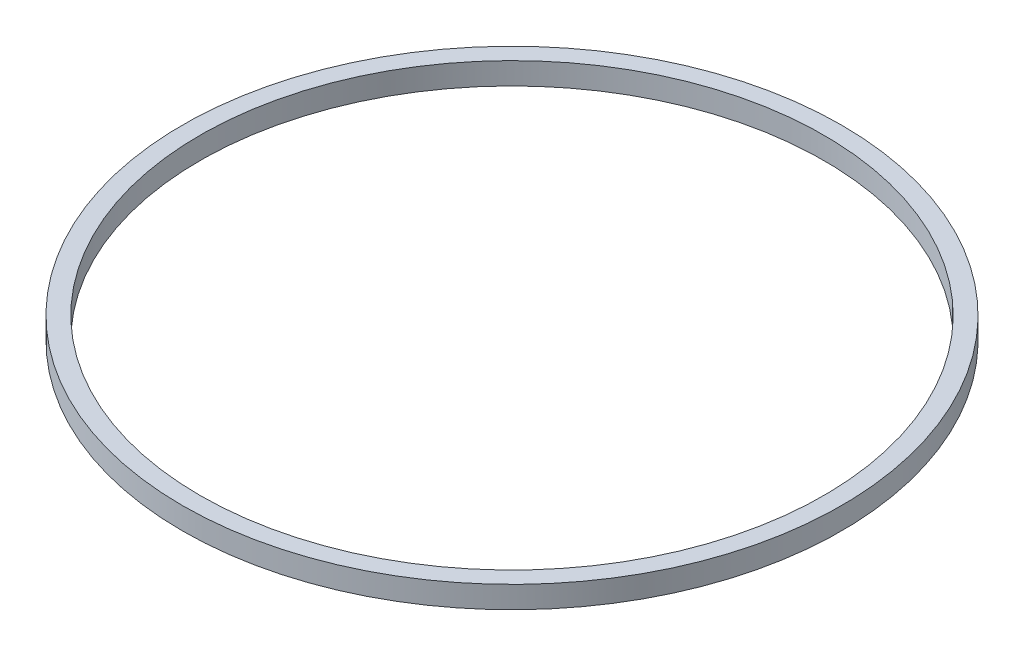
ISO-10303-21;
HEADER;
FILE_DESCRIPTION(('STEP AP214'),'2;1');
FILE_NAME('part.step','',(''),(''),'','','');
FILE_SCHEMA(('AUTOMOTIVE_DESIGN { 1 0 10303 214 1 1 1 1 }'));
ENDSEC;
DATA;
#1=APPLICATION_CONTEXT('core data for automotive mechanical design processes');
#2=APPLICATION_PROTOCOL_DEFINITION('international standard','automotive_design',2000,#1);
#3=PRODUCT_CONTEXT('',#1,'mechanical');
#4=PRODUCT('Part','Part','',(#3));
#5=PRODUCT_RELATED_PRODUCT_CATEGORY('part','',(#4));
#6=PRODUCT_DEFINITION_FORMATION('','',#4);
#7=PRODUCT_DEFINITION_CONTEXT('part definition',#1,'design');
#8=PRODUCT_DEFINITION('design','',#6,#7);
#9=PRODUCT_DEFINITION_SHAPE('','',#8);
#10=(LENGTH_UNIT() NAMED_UNIT(*) SI_UNIT(.MILLI.,.METRE.));
#11=(NAMED_UNIT(*) PLANE_ANGLE_UNIT() SI_UNIT($,.RADIAN.));
#12=(NAMED_UNIT(*) SI_UNIT($,.STERADIAN.) SOLID_ANGLE_UNIT());
#13=UNCERTAINTY_MEASURE_WITH_UNIT(LENGTH_MEASURE(1.E-05),#10,'distance_accuracy_value','');
#14=(GEOMETRIC_REPRESENTATION_CONTEXT(3) GLOBAL_UNCERTAINTY_ASSIGNED_CONTEXT((#13)) GLOBAL_UNIT_ASSIGNED_CONTEXT((#10,
#11,#12)) REPRESENTATION_CONTEXT('',''));
#15=CARTESIAN_POINT('',(0.,0.,0.));
#16=DIRECTION('',(0.,0.,1.));
#17=DIRECTION('',(1.,0.,0.));
#18=AXIS2_PLACEMENT_3D('',#15,#16,#17);
#19=CARTESIAN_POINT('',(0.,5.,0.));
#20=DIRECTION('',(0.,1.,0.));
#21=DIRECTION('',(0.,0.,1.));
#22=AXIS2_PLACEMENT_3D('',#19,#20,#21);
#23=PLANE('',#22);
#24=CARTESIAN_POINT('',(0.,5.,0.));
#25=DIRECTION('',(0.,1.,0.));
#26=DIRECTION('',(0.,0.,1.));
#27=AXIS2_PLACEMENT_3D('',#24,#25,#26);
#28=CIRCLE('',#27,75.);
#29=CARTESIAN_POINT('',(0.,5.,75.));
#30=VERTEX_POINT('',#29);
#31=EDGE_CURVE('E10',#30,#30,#28,.T.);
#32=ORIENTED_EDGE('',*,*,#31,.T.);
#33=EDGE_LOOP('',(#32));
#34=FACE_BOUND('',#33,.T.);
#35=CARTESIAN_POINT('',(0.,5.,0.));
#36=DIRECTION('',(0.,1.,0.));
#37=DIRECTION('',(0.,0.,1.));
#38=AXIS2_PLACEMENT_3D('',#35,#36,#37);
#39=CIRCLE('',#38,71.);
#40=CARTESIAN_POINT('',(0.,5.,71.));
#41=VERTEX_POINT('',#40);
#42=EDGE_CURVE('E56',#41,#41,#39,.T.);
#43=ORIENTED_EDGE('',*,*,#42,.F.);
#44=EDGE_LOOP('',(#43));
#45=FACE_BOUND('',#44,.T.);
#46=ADVANCED_FACE('F43',(#34,#45),#23,.T.);
#47=CARTESIAN_POINT('',(0.,0.,0.));
#48=DIRECTION('',(0.,1.,0.));
#49=DIRECTION('',(0.,0.,1.));
#50=AXIS2_PLACEMENT_3D('',#47,#48,#49);
#51=PLANE('',#50);
#52=CARTESIAN_POINT('',(0.,0.,0.));
#53=DIRECTION('',(0.,1.,0.));
#54=DIRECTION('',(0.,0.,1.));
#55=AXIS2_PLACEMENT_3D('',#52,#53,#54);
#56=CIRCLE('',#55,75.);
#57=CARTESIAN_POINT('',(0.,0.,75.));
#58=VERTEX_POINT('',#57);
#59=EDGE_CURVE('E47',#58,#58,#56,.T.);
#60=ORIENTED_EDGE('',*,*,#59,.F.);
#61=EDGE_LOOP('',(#60));
#62=FACE_BOUND('',#61,.T.);
#63=CARTESIAN_POINT('',(0.,0.,0.));
#64=DIRECTION('',(0.,1.,0.));
#65=DIRECTION('',(0.,0.,1.));
#66=AXIS2_PLACEMENT_3D('',#63,#64,#65);
#67=CIRCLE('',#66,71.);
#68=CARTESIAN_POINT('',(0.,0.,71.));
#69=VERTEX_POINT('',#68);
#70=EDGE_CURVE('E58',#69,#69,#67,.T.);
#71=ORIENTED_EDGE('',*,*,#70,.T.);
#72=EDGE_LOOP('',(#71));
#73=FACE_BOUND('',#72,.T.);
#74=ADVANCED_FACE('F70',(#62,#73),#51,.F.);
#75=CARTESIAN_POINT('',(0.,5.,0.));
#76=DIRECTION('',(0.,-1.,0.));
#77=DIRECTION('',(0.,0.,-1.));
#78=AXIS2_PLACEMENT_3D('',#75,#76,#77);
#79=CYLINDRICAL_SURFACE('',#78,75.);
#80=ORIENTED_EDGE('',*,*,#31,.F.);
#81=EDGE_LOOP('',(#80));
#82=FACE_BOUND('',#81,.T.);
#83=ORIENTED_EDGE('',*,*,#59,.T.);
#84=EDGE_LOOP('',(#83));
#85=FACE_BOUND('',#84,.T.);
#86=ADVANCED_FACE('F45',(#82,#85),#79,.T.);
#87=CARTESIAN_POINT('',(0.,5.,0.));
#88=DIRECTION('',(0.,-1.,0.));
#89=DIRECTION('',(0.,0.,-1.));
#90=AXIS2_PLACEMENT_3D('',#87,#88,#89);
#91=CYLINDRICAL_SURFACE('',#90,71.);
#92=ORIENTED_EDGE('',*,*,#42,.T.);
#93=EDGE_LOOP('',(#92));
#94=FACE_BOUND('',#93,.T.);
#95=ORIENTED_EDGE('',*,*,#70,.F.);
#96=EDGE_LOOP('',(#95));
#97=FACE_BOUND('',#96,.T.);
#98=ADVANCED_FACE('F66',(#94,#97),#91,.F.);
#99=CLOSED_SHELL('',(#46,#74,#86,#98));
#100=MANIFOLD_SOLID_BREP('B2',#99);
#101=ADVANCED_BREP_SHAPE_REPRESENTATION('',(#18,#100),#14);
#102=SHAPE_DEFINITION_REPRESENTATION(#9,#101);
ENDSEC;
END-ISO-10303-21;
